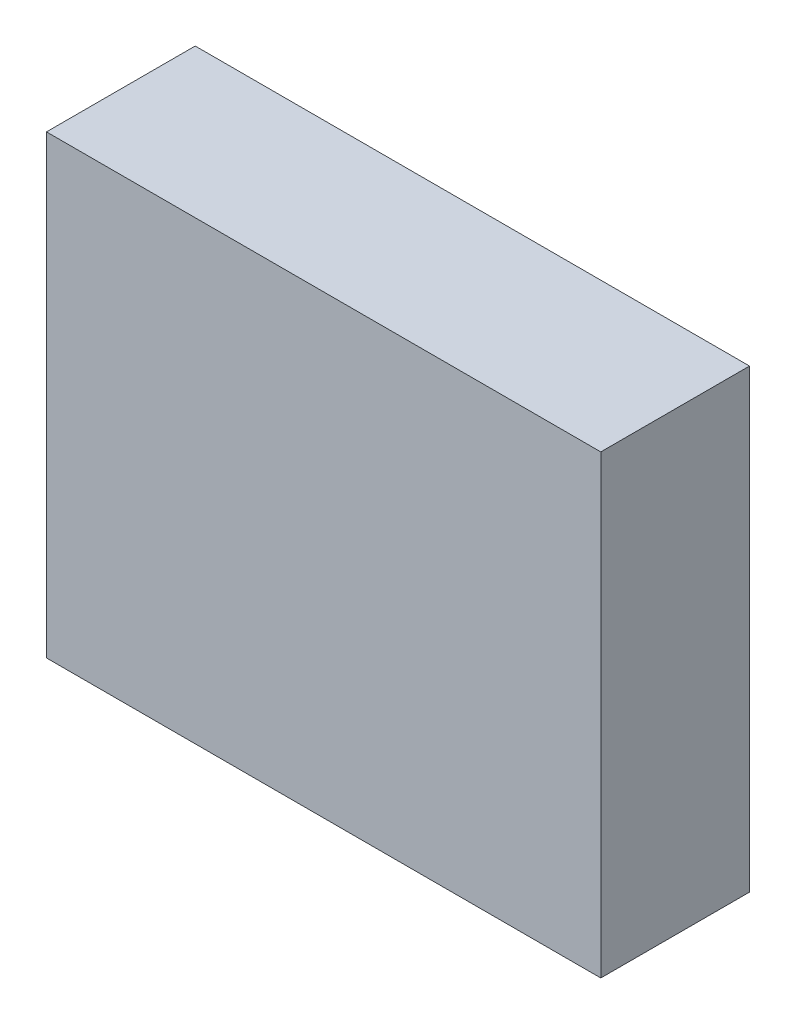
ISO-10303-21;
HEADER;
FILE_DESCRIPTION(('STEP AP214'),'2;1');
FILE_NAME('part.step','',(''),(''),'','','');
FILE_SCHEMA(('AUTOMOTIVE_DESIGN { 1 0 10303 214 1 1 1 1 }'));
ENDSEC;
DATA;
#1=APPLICATION_CONTEXT('core data for automotive mechanical design processes');
#2=APPLICATION_PROTOCOL_DEFINITION('international standard','automotive_design',2000,#1);
#3=PRODUCT_CONTEXT('',#1,'mechanical');
#4=PRODUCT('Part','Part','',(#3));
#5=PRODUCT_RELATED_PRODUCT_CATEGORY('part','',(#4));
#6=PRODUCT_DEFINITION_FORMATION('','',#4);
#7=PRODUCT_DEFINITION_CONTEXT('part definition',#1,'design');
#8=PRODUCT_DEFINITION('design','',#6,#7);
#9=PRODUCT_DEFINITION_SHAPE('','',#8);
#10=(LENGTH_UNIT() NAMED_UNIT(*) SI_UNIT(.MILLI.,.METRE.));
#11=(NAMED_UNIT(*) PLANE_ANGLE_UNIT() SI_UNIT($,.RADIAN.));
#12=(NAMED_UNIT(*) SI_UNIT($,.STERADIAN.) SOLID_ANGLE_UNIT());
#13=UNCERTAINTY_MEASURE_WITH_UNIT(LENGTH_MEASURE(1.E-05),#10,'distance_accuracy_value','');
#14=(GEOMETRIC_REPRESENTATION_CONTEXT(3) GLOBAL_UNCERTAINTY_ASSIGNED_CONTEXT((#13)) GLOBAL_UNIT_ASSIGNED_CONTEXT((#10,
#11,#12)) REPRESENTATION_CONTEXT('',''));
#15=CARTESIAN_POINT('',(0.,0.,0.));
#16=DIRECTION('',(0.,0.,1.));
#17=DIRECTION('',(1.,0.,0.));
#18=AXIS2_PLACEMENT_3D('',#15,#16,#17);
#19=CARTESIAN_POINT('',(-1.8635,-1.5,1.));
#20=DIRECTION('',(1.,0.,0.));
#21=DIRECTION('',(0.,0.,-1.));
#22=AXIS2_PLACEMENT_3D('',#19,#20,#21);
#23=PLANE('',#22);
#24=DIRECTION('',(0.,-1.,0.));
#25=VECTOR('',#24,1.);
#26=CARTESIAN_POINT('',(-1.8635,-1.5,0.));
#27=LINE('',#26,#25);
#28=CARTESIAN_POINT('',(-1.8635,1.5635,0.));
#29=VERTEX_POINT('',#28);
#30=CARTESIAN_POINT('',(-1.8635,-1.5,0.));
#31=VERTEX_POINT('',#30);
#32=EDGE_CURVE('E95',#29,#31,#27,.T.);
#33=ORIENTED_EDGE('',*,*,#32,.T.);
#34=DIRECTION('',(0.,0.,-1.));
#35=VECTOR('',#34,1.);
#36=CARTESIAN_POINT('',(-1.8635,-1.5,1.));
#37=LINE('',#36,#35);
#38=CARTESIAN_POINT('',(-1.8635,-1.5,1.));
#39=VERTEX_POINT('',#38);
#40=EDGE_CURVE('E11',#39,#31,#37,.T.);
#41=ORIENTED_EDGE('',*,*,#40,.F.);
#42=DIRECTION('',(0.,-1.,0.));
#43=VECTOR('',#42,1.);
#44=CARTESIAN_POINT('',(-1.8635,-1.5,1.));
#45=LINE('',#44,#43);
#46=CARTESIAN_POINT('',(-1.8635,1.5635,1.));
#47=VERTEX_POINT('',#46);
#48=EDGE_CURVE('E83',#47,#39,#45,.T.);
#49=ORIENTED_EDGE('',*,*,#48,.F.);
#50=DIRECTION('',(0.,0.,-1.));
#51=VECTOR('',#50,1.);
#52=CARTESIAN_POINT('',(-1.8635,1.5635,1.));
#53=LINE('',#52,#51);
#54=EDGE_CURVE('E91',#47,#29,#53,.T.);
#55=ORIENTED_EDGE('',*,*,#54,.T.);
#56=EDGE_LOOP('',(#33,#41,#49,#55));
#57=FACE_BOUND('',#56,.T.);
#58=ADVANCED_FACE('F32',(#57),#23,.F.);
#59=CARTESIAN_POINT('',(1.8635,-1.5,1.));
#60=DIRECTION('',(0.,1.,0.));
#61=DIRECTION('',(0.,0.,1.));
#62=AXIS2_PLACEMENT_3D('',#59,#60,#61);
#63=PLANE('',#62);
#64=DIRECTION('',(1.,0.,0.));
#65=VECTOR('',#64,1.);
#66=CARTESIAN_POINT('',(1.8635,-1.5,0.));
#67=LINE('',#66,#65);
#68=CARTESIAN_POINT('',(1.8635,-1.5,0.));
#69=VERTEX_POINT('',#68);
#70=EDGE_CURVE('E87',#31,#69,#67,.T.);
#71=ORIENTED_EDGE('',*,*,#70,.T.);
#72=DIRECTION('',(0.,0.,-1.));
#73=VECTOR('',#72,1.);
#74=CARTESIAN_POINT('',(1.8635,-1.5,1.));
#75=LINE('',#74,#73);
#76=CARTESIAN_POINT('',(1.8635,-1.5,1.));
#77=VERTEX_POINT('',#76);
#78=EDGE_CURVE('E40',#77,#69,#75,.T.);
#79=ORIENTED_EDGE('',*,*,#78,.F.);
#80=DIRECTION('',(1.,0.,0.));
#81=VECTOR('',#80,1.);
#82=CARTESIAN_POINT('',(1.8635,-1.5,1.));
#83=LINE('',#82,#81);
#84=EDGE_CURVE('E78',#39,#77,#83,.T.);
#85=ORIENTED_EDGE('',*,*,#84,.F.);
#86=ORIENTED_EDGE('',*,*,#40,.T.);
#87=EDGE_LOOP('',(#71,#79,#85,#86));
#88=FACE_BOUND('',#87,.T.);
#89=ADVANCED_FACE('F86',(#88),#63,.F.);
#90=CARTESIAN_POINT('',(1.8635,1.5635,1.));
#91=DIRECTION('',(-1.,0.,0.));
#92=DIRECTION('',(0.,0.,1.));
#93=AXIS2_PLACEMENT_3D('',#90,#91,#92);
#94=PLANE('',#93);
#95=DIRECTION('',(0.,1.,0.));
#96=VECTOR('',#95,1.);
#97=CARTESIAN_POINT('',(1.8635,1.5635,0.));
#98=LINE('',#97,#96);
#99=CARTESIAN_POINT('',(1.8635,1.5635,0.));
#100=VERTEX_POINT('',#99);
#101=EDGE_CURVE('E65',#69,#100,#98,.T.);
#102=ORIENTED_EDGE('',*,*,#101,.T.);
#103=DIRECTION('',(0.,0.,-1.));
#104=VECTOR('',#103,1.);
#105=CARTESIAN_POINT('',(1.8635,1.5635,1.));
#106=LINE('',#105,#104);
#107=CARTESIAN_POINT('',(1.8635,1.5635,1.));
#108=VERTEX_POINT('',#107);
#109=EDGE_CURVE('E88',#108,#100,#106,.T.);
#110=ORIENTED_EDGE('',*,*,#109,.F.);
#111=DIRECTION('',(0.,1.,0.));
#112=VECTOR('',#111,1.);
#113=CARTESIAN_POINT('',(1.8635,1.5635,1.));
#114=LINE('',#113,#112);
#115=EDGE_CURVE('E81',#77,#108,#114,.T.);
#116=ORIENTED_EDGE('',*,*,#115,.F.);
#117=ORIENTED_EDGE('',*,*,#78,.T.);
#118=EDGE_LOOP('',(#102,#110,#116,#117));
#119=FACE_BOUND('',#118,.T.);
#120=ADVANCED_FACE('F89',(#119),#94,.F.);
#121=CARTESIAN_POINT('',(-1.8635,1.5635,1.));
#122=DIRECTION('',(0.,-1.,0.));
#123=DIRECTION('',(0.,0.,-1.));
#124=AXIS2_PLACEMENT_3D('',#121,#122,#123);
#125=PLANE('',#124);
#126=DIRECTION('',(-1.,0.,0.));
#127=VECTOR('',#126,1.);
#128=CARTESIAN_POINT('',(-1.8635,1.5635,0.));
#129=LINE('',#128,#127);
#130=EDGE_CURVE('E71',#100,#29,#129,.T.);
#131=ORIENTED_EDGE('',*,*,#130,.T.);
#132=ORIENTED_EDGE('',*,*,#54,.F.);
#133=DIRECTION('',(-1.,0.,0.));
#134=VECTOR('',#133,1.);
#135=CARTESIAN_POINT('',(-1.8635,1.5635,1.));
#136=LINE('',#135,#134);
#137=EDGE_CURVE('E48',#108,#47,#136,.T.);
#138=ORIENTED_EDGE('',*,*,#137,.F.);
#139=ORIENTED_EDGE('',*,*,#109,.T.);
#140=EDGE_LOOP('',(#131,#132,#138,#139));
#141=FACE_BOUND('',#140,.T.);
#142=ADVANCED_FACE('F102',(#141),#125,.F.);
#143=CARTESIAN_POINT('',(0.,0.,1.));
#144=DIRECTION('',(0.,0.,-1.));
#145=DIRECTION('',(-1.,0.,0.));
#146=AXIS2_PLACEMENT_3D('',#143,#144,#145);
#147=PLANE('',#146);
#148=ORIENTED_EDGE('',*,*,#48,.T.);
#149=ORIENTED_EDGE('',*,*,#84,.T.);
#150=ORIENTED_EDGE('',*,*,#115,.T.);
#151=ORIENTED_EDGE('',*,*,#137,.T.);
#152=EDGE_LOOP('',(#148,#149,#150,#151));
#153=FACE_BOUND('',#152,.T.);
#154=ADVANCED_FACE('F79',(#153),#147,.F.);
#155=CARTESIAN_POINT('',(0.,0.,0.));
#156=DIRECTION('',(0.,0.,-1.));
#157=DIRECTION('',(-1.,0.,0.));
#158=AXIS2_PLACEMENT_3D('',#155,#156,#157);
#159=PLANE('',#158);
#160=ORIENTED_EDGE('',*,*,#32,.F.);
#161=ORIENTED_EDGE('',*,*,#130,.F.);
#162=ORIENTED_EDGE('',*,*,#101,.F.);
#163=ORIENTED_EDGE('',*,*,#70,.F.);
#164=EDGE_LOOP('',(#160,#161,#162,#163));
#165=FACE_BOUND('',#164,.T.);
#166=ADVANCED_FACE('F105',(#165),#159,.T.);
#167=CLOSED_SHELL('',(#58,#89,#120,#142,#154,#166));
#168=MANIFOLD_SOLID_BREP('B2',#167);
#169=ADVANCED_BREP_SHAPE_REPRESENTATION('',(#18,#168),#14);
#170=SHAPE_DEFINITION_REPRESENTATION(#9,#169);
ENDSEC;
END-ISO-10303-21;
